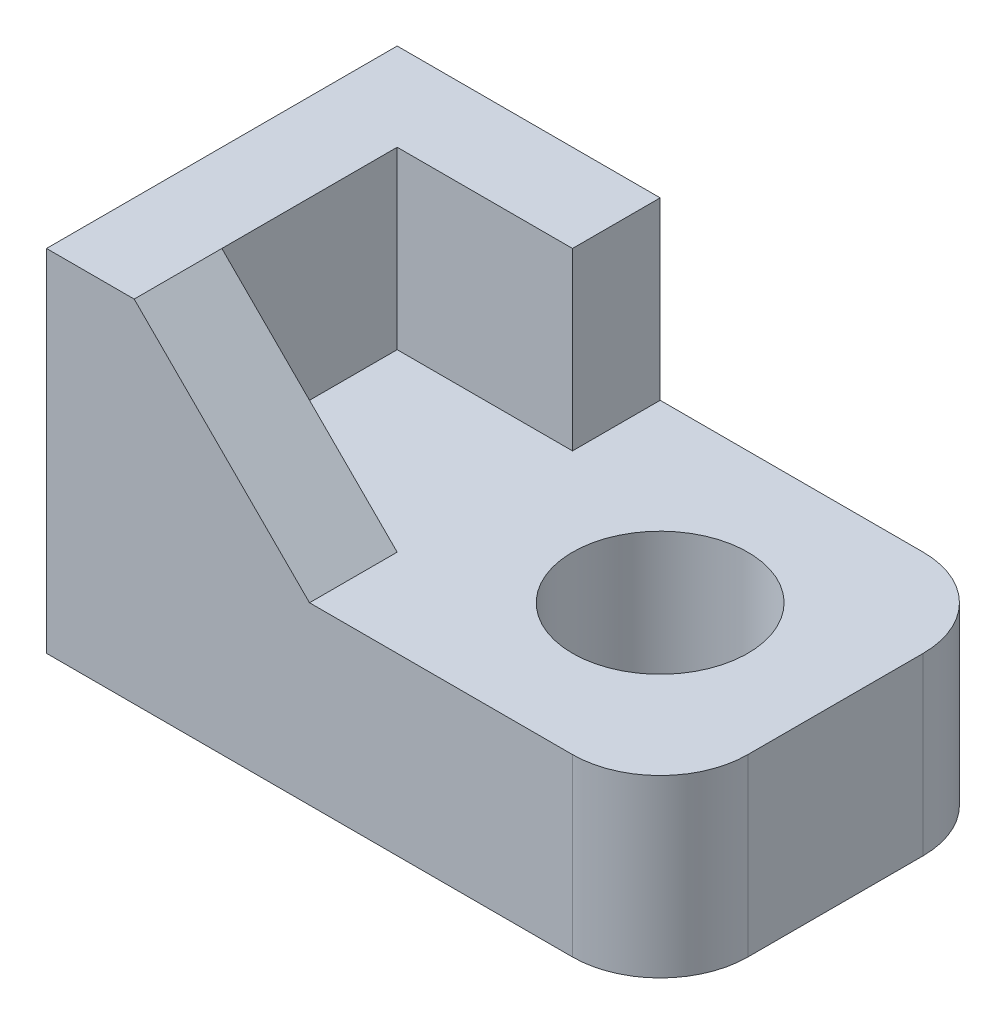
ISO-10303-21;
HEADER;
FILE_DESCRIPTION(('STEP AP214'),'2;1');
FILE_NAME('part.step','',(''),(''),'','','');
FILE_SCHEMA(('AUTOMOTIVE_DESIGN { 1 0 10303 214 1 1 1 1 }'));
ENDSEC;
DATA;
#1=APPLICATION_CONTEXT('core data for automotive mechanical design processes');
#2=APPLICATION_PROTOCOL_DEFINITION('international standard','automotive_design',2000,#1);
#3=PRODUCT_CONTEXT('',#1,'mechanical');
#4=PRODUCT('Part','Part','',(#3));
#5=PRODUCT_RELATED_PRODUCT_CATEGORY('part','',(#4));
#6=PRODUCT_DEFINITION_FORMATION('','',#4);
#7=PRODUCT_DEFINITION_CONTEXT('part definition',#1,'design');
#8=PRODUCT_DEFINITION('design','',#6,#7);
#9=PRODUCT_DEFINITION_SHAPE('','',#8);
#10=(LENGTH_UNIT() NAMED_UNIT(*) SI_UNIT(.MILLI.,.METRE.));
#11=(NAMED_UNIT(*) PLANE_ANGLE_UNIT() SI_UNIT($,.RADIAN.));
#12=(NAMED_UNIT(*) SI_UNIT($,.STERADIAN.) SOLID_ANGLE_UNIT());
#13=UNCERTAINTY_MEASURE_WITH_UNIT(LENGTH_MEASURE(1.E-05),#10,'distance_accuracy_value','');
#14=(GEOMETRIC_REPRESENTATION_CONTEXT(3) GLOBAL_UNCERTAINTY_ASSIGNED_CONTEXT((#13)) GLOBAL_UNIT_ASSIGNED_CONTEXT((#10,
#11,#12)) REPRESENTATION_CONTEXT('',''));
#15=CARTESIAN_POINT('',(0.,0.,0.));
#16=DIRECTION('',(0.,0.,1.));
#17=DIRECTION('',(1.,0.,0.));
#18=AXIS2_PLACEMENT_3D('',#15,#16,#17);
#19=CARTESIAN_POINT('',(0.,10.,0.));
#20=DIRECTION('',(0.,-1.,0.));
#21=DIRECTION('',(0.,0.,-1.));
#22=AXIS2_PLACEMENT_3D('',#19,#20,#21);
#23=PLANE('',#22);
#24=CARTESIAN_POINT('',(0.,10.,0.));
#25=DIRECTION('',(0.,1.,0.));
#26=DIRECTION('',(0.,0.,1.));
#27=AXIS2_PLACEMENT_3D('',#24,#25,#26);
#28=CIRCLE('',#27,5.);
#29=CARTESIAN_POINT('',(0.,10.,5.));
#30=VERTEX_POINT('',#29);
#31=EDGE_CURVE('E165',#30,#30,#28,.T.);
#32=ORIENTED_EDGE('',*,*,#31,.F.);
#33=EDGE_LOOP('',(#32));
#34=FACE_BOUND('',#33,.T.);
#35=DIRECTION('',(0.,0.,-1.));
#36=VECTOR('',#35,1.);
#37=CARTESIAN_POINT('',(10.,10.,-10.));
#38=LINE('',#37,#36);
#39=CARTESIAN_POINT('',(10.,10.,5.));
#40=VERTEX_POINT('',#39);
#41=CARTESIAN_POINT('',(10.,10.,-5.));
#42=VERTEX_POINT('',#41);
#43=EDGE_CURVE('E171',#40,#42,#38,.T.);
#44=ORIENTED_EDGE('',*,*,#43,.T.);
#45=CARTESIAN_POINT('',(5.,10.,-5.));
#46=DIRECTION('',(0.,-1.,0.));
#47=DIRECTION('',(0.,0.,-1.));
#48=AXIS2_PLACEMENT_3D('',#45,#46,#47);
#49=CIRCLE('',#48,5.);
#50=CARTESIAN_POINT('',(5.,10.,-10.));
#51=VERTEX_POINT('',#50);
#52=EDGE_CURVE('E43',#42,#51,#49,.F.);
#53=ORIENTED_EDGE('',*,*,#52,.T.);
#54=DIRECTION('',(-1.,0.,0.));
#55=VECTOR('',#54,1.);
#56=CARTESIAN_POINT('',(10.,10.,-10.));
#57=LINE('',#56,#55);
#58=CARTESIAN_POINT('',(-10.,10.,-10.));
#59=VERTEX_POINT('',#58);
#60=EDGE_CURVE('E173',#51,#59,#57,.T.);
#61=ORIENTED_EDGE('',*,*,#60,.T.);
#62=DIRECTION('',(0.,0.,1.));
#63=VECTOR('',#62,1.);
#64=CARTESIAN_POINT('',(-10.,10.,0.));
#65=LINE('',#64,#63);
#66=CARTESIAN_POINT('',(-10.,10.,-5.));
#67=VERTEX_POINT('',#66);
#68=EDGE_CURVE('E147',#59,#67,#65,.T.);
#69=ORIENTED_EDGE('',*,*,#68,.T.);
#70=DIRECTION('',(-1.,0.,0.));
#71=VECTOR('',#70,1.);
#72=CARTESIAN_POINT('',(0.,10.,-5.));
#73=LINE('',#72,#71);
#74=CARTESIAN_POINT('',(-20.,10.,-5.));
#75=VERTEX_POINT('',#74);
#76=EDGE_CURVE('E144',#67,#75,#73,.T.);
#77=ORIENTED_EDGE('',*,*,#76,.T.);
#78=DIRECTION('',(0.,0.,-1.));
#79=VECTOR('',#78,1.);
#80=CARTESIAN_POINT('',(-20.,10.,0.));
#81=LINE('',#80,#79);
#82=CARTESIAN_POINT('',(-20.,10.,5.));
#83=VERTEX_POINT('',#82);
#84=EDGE_CURVE('E138',#83,#75,#81,.T.);
#85=ORIENTED_EDGE('',*,*,#84,.F.);
#86=DIRECTION('',(-1.,0.,0.));
#87=VECTOR('',#86,1.);
#88=CARTESIAN_POINT('',(0.,10.,5.));
#89=LINE('',#88,#87);
#90=CARTESIAN_POINT('',(-10.,10.,5.));
#91=VERTEX_POINT('',#90);
#92=EDGE_CURVE('E123',#91,#83,#89,.T.);
#93=ORIENTED_EDGE('',*,*,#92,.F.);
#94=DIRECTION('',(0.,0.,1.));
#95=VECTOR('',#94,1.);
#96=CARTESIAN_POINT('',(-10.,10.,5.));
#97=LINE('',#96,#95);
#98=CARTESIAN_POINT('',(-10.,10.,10.));
#99=VERTEX_POINT('',#98);
#100=EDGE_CURVE('E133',#91,#99,#97,.T.);
#101=ORIENTED_EDGE('',*,*,#100,.T.);
#102=DIRECTION('',(1.,0.,0.));
#103=VECTOR('',#102,1.);
#104=CARTESIAN_POINT('',(10.,10.,10.));
#105=LINE('',#104,#103);
#106=CARTESIAN_POINT('',(5.,10.,10.));
#107=VERTEX_POINT('',#106);
#108=EDGE_CURVE('E176',#99,#107,#105,.T.);
#109=ORIENTED_EDGE('',*,*,#108,.T.);
#110=CARTESIAN_POINT('',(5.,10.,5.));
#111=DIRECTION('',(0.,-1.,0.));
#112=DIRECTION('',(0.,0.,-1.));
#113=AXIS2_PLACEMENT_3D('',#110,#111,#112);
#114=CIRCLE('',#113,5.);
#115=EDGE_CURVE('E201',#107,#40,#114,.F.);
#116=ORIENTED_EDGE('',*,*,#115,.T.);
#117=EDGE_LOOP('',(#44,#53,#61,#69,#77,#85,#93,#101,#109,#116));
#118=FACE_BOUND('',#117,.T.);
#119=ADVANCED_FACE('F35',(#34,#118),#23,.F.);
#120=CARTESIAN_POINT('',(-20.,20.,0.));
#121=DIRECTION('',(-1.,0.,0.));
#122=DIRECTION('',(0.,0.,1.));
#123=AXIS2_PLACEMENT_3D('',#120,#121,#122);
#124=PLANE('',#123);
#125=DIRECTION('',(0.,1.,0.));
#126=VECTOR('',#125,1.);
#127=CARTESIAN_POINT('',(-20.,0.,5.));
#128=LINE('',#127,#126);
#129=CARTESIAN_POINT('',(-20.,20.,5.));
#130=VERTEX_POINT('',#129);
#131=EDGE_CURVE('E126',#83,#130,#128,.T.);
#132=ORIENTED_EDGE('',*,*,#131,.F.);
#133=ORIENTED_EDGE('',*,*,#84,.T.);
#134=DIRECTION('',(0.,-1.,0.));
#135=VECTOR('',#134,1.);
#136=CARTESIAN_POINT('',(-20.,20.,-5.));
#137=LINE('',#136,#135);
#138=CARTESIAN_POINT('',(-20.,20.,-5.));
#139=VERTEX_POINT('',#138);
#140=EDGE_CURVE('E162',#139,#75,#137,.T.);
#141=ORIENTED_EDGE('',*,*,#140,.F.);
#142=DIRECTION('',(0.,0.,-1.));
#143=VECTOR('',#142,1.);
#144=CARTESIAN_POINT('',(-20.,20.,0.));
#145=LINE('',#144,#143);
#146=EDGE_CURVE('E140',#130,#139,#145,.T.);
#147=ORIENTED_EDGE('',*,*,#146,.F.);
#148=EDGE_LOOP('',(#132,#133,#141,#147));
#149=FACE_BOUND('',#148,.T.);
#150=ADVANCED_FACE('F136',(#149),#124,.F.);
#151=CARTESIAN_POINT('',(0.,0.,0.));
#152=DIRECTION('',(0.,-1.,0.));
#153=DIRECTION('',(0.,0.,-1.));
#154=AXIS2_PLACEMENT_3D('',#151,#152,#153);
#155=PLANE('',#154);
#156=DIRECTION('',(-1.,0.,0.));
#157=VECTOR('',#156,1.);
#158=CARTESIAN_POINT('',(10.,0.,-10.));
#159=LINE('',#158,#157);
#160=CARTESIAN_POINT('',(5.,0.,-10.));
#161=VERTEX_POINT('',#160);
#162=CARTESIAN_POINT('',(-25.,0.,-9.99999999999999));
#163=VERTEX_POINT('',#162);
#164=EDGE_CURVE('E180',#161,#163,#159,.T.);
#165=ORIENTED_EDGE('',*,*,#164,.F.);
#166=CARTESIAN_POINT('',(5.,0.,-5.));
#167=DIRECTION('',(0.,-1.,0.));
#168=DIRECTION('',(0.,0.,-1.));
#169=AXIS2_PLACEMENT_3D('',#166,#167,#168);
#170=CIRCLE('',#169,5.);
#171=CARTESIAN_POINT('',(10.,0.,-5.));
#172=VERTEX_POINT('',#171);
#173=EDGE_CURVE('E195',#161,#172,#170,.T.);
#174=ORIENTED_EDGE('',*,*,#173,.T.);
#175=DIRECTION('',(0.,0.,-1.));
#176=VECTOR('',#175,1.);
#177=CARTESIAN_POINT('',(10.,0.,-10.));
#178=LINE('',#177,#176);
#179=CARTESIAN_POINT('',(10.,0.,5.));
#180=VERTEX_POINT('',#179);
#181=EDGE_CURVE('E168',#180,#172,#178,.T.);
#182=ORIENTED_EDGE('',*,*,#181,.F.);
#183=CARTESIAN_POINT('',(5.,0.,5.));
#184=DIRECTION('',(0.,-1.,0.));
#185=DIRECTION('',(0.,0.,-1.));
#186=AXIS2_PLACEMENT_3D('',#183,#184,#185);
#187=CIRCLE('',#186,5.);
#188=CARTESIAN_POINT('',(5.,0.,10.));
#189=VERTEX_POINT('',#188);
#190=EDGE_CURVE('E193',#180,#189,#187,.T.);
#191=ORIENTED_EDGE('',*,*,#190,.T.);
#192=DIRECTION('',(1.,0.,0.));
#193=VECTOR('',#192,1.);
#194=CARTESIAN_POINT('',(10.,0.,10.));
#195=LINE('',#194,#193);
#196=CARTESIAN_POINT('',(-25.,0.,9.99999999999999));
#197=VERTEX_POINT('',#196);
#198=EDGE_CURVE('E174',#197,#189,#195,.T.);
#199=ORIENTED_EDGE('',*,*,#198,.F.);
#200=DIRECTION('',(0.,0.,1.));
#201=VECTOR('',#200,1.);
#202=CARTESIAN_POINT('',(-25.,0.,-9.99999999999999));
#203=LINE('',#202,#201);
#204=EDGE_CURVE('E182',#163,#197,#203,.T.);
#205=ORIENTED_EDGE('',*,*,#204,.F.);
#206=EDGE_LOOP('',(#165,#174,#182,#191,#199,#205));
#207=FACE_BOUND('',#206,.T.);
#208=CARTESIAN_POINT('',(0.,0.,0.));
#209=DIRECTION('',(0.,1.,0.));
#210=DIRECTION('',(0.,0.,1.));
#211=AXIS2_PLACEMENT_3D('',#208,#209,#210);
#212=CIRCLE('',#211,5.);
#213=CARTESIAN_POINT('',(0.,0.,5.));
#214=VERTEX_POINT('',#213);
#215=EDGE_CURVE('E164',#214,#214,#212,.T.);
#216=ORIENTED_EDGE('',*,*,#215,.T.);
#217=EDGE_LOOP('',(#216));
#218=FACE_BOUND('',#217,.T.);
#219=ADVANCED_FACE('F214',(#207,#218),#155,.T.);
#220=CARTESIAN_POINT('',(10.,10.,-10.));
#221=DIRECTION('',(-1.,0.,0.));
#222=DIRECTION('',(0.,0.,1.));
#223=AXIS2_PLACEMENT_3D('',#220,#221,#222);
#224=PLANE('',#223);
#225=ORIENTED_EDGE('',*,*,#181,.T.);
#226=DIRECTION('',(0.,-1.,0.));
#227=VECTOR('',#226,1.);
#228=CARTESIAN_POINT('',(10.,10.,-5.));
#229=LINE('',#228,#227);
#230=EDGE_CURVE('E56',#172,#42,#229,.F.);
#231=ORIENTED_EDGE('',*,*,#230,.T.);
#232=ORIENTED_EDGE('',*,*,#43,.F.);
#233=DIRECTION('',(0.,-1.,0.));
#234=VECTOR('',#233,1.);
#235=CARTESIAN_POINT('',(10.,10.,5.));
#236=LINE('',#235,#234);
#237=EDGE_CURVE('E197',#40,#180,#236,.T.);
#238=ORIENTED_EDGE('',*,*,#237,.T.);
#239=EDGE_LOOP('',(#225,#231,#232,#238));
#240=FACE_BOUND('',#239,.T.);
#241=ADVANCED_FACE('F217',(#240),#224,.F.);
#242=CARTESIAN_POINT('',(10.,10.,-10.));
#243=DIRECTION('',(0.,0.,1.));
#244=DIRECTION('',(1.,0.,0.));
#245=AXIS2_PLACEMENT_3D('',#242,#243,#244);
#246=PLANE('',#245);
#247=ORIENTED_EDGE('',*,*,#60,.F.);
#248=DIRECTION('',(0.,-1.,0.));
#249=VECTOR('',#248,1.);
#250=CARTESIAN_POINT('',(5.,10.,-10.));
#251=LINE('',#250,#249);
#252=EDGE_CURVE('E190',#51,#161,#251,.T.);
#253=ORIENTED_EDGE('',*,*,#252,.T.);
#254=ORIENTED_EDGE('',*,*,#164,.T.);
#255=DIRECTION('',(0.,-1.,0.));
#256=VECTOR('',#255,1.);
#257=CARTESIAN_POINT('',(-25.,10.,-9.99999999999999));
#258=LINE('',#257,#256);
#259=CARTESIAN_POINT('',(-25.,20.,-9.99999999999999));
#260=VERTEX_POINT('',#259);
#261=EDGE_CURVE('E187',#260,#163,#258,.T.);
#262=ORIENTED_EDGE('',*,*,#261,.F.);
#263=DIRECTION('',(-1.,0.,0.));
#264=VECTOR('',#263,1.);
#265=CARTESIAN_POINT('',(0.,20.,-10.));
#266=LINE('',#265,#264);
#267=CARTESIAN_POINT('',(-10.,20.,-10.));
#268=VERTEX_POINT('',#267);
#269=EDGE_CURVE('E151',#268,#260,#266,.T.);
#270=ORIENTED_EDGE('',*,*,#269,.F.);
#271=DIRECTION('',(0.,-1.,0.));
#272=VECTOR('',#271,1.);
#273=CARTESIAN_POINT('',(-10.,20.,-10.));
#274=LINE('',#273,#272);
#275=EDGE_CURVE('E156',#268,#59,#274,.T.);
#276=ORIENTED_EDGE('',*,*,#275,.T.);
#277=EDGE_LOOP('',(#247,#253,#254,#262,#270,#276));
#278=FACE_BOUND('',#277,.T.);
#279=ADVANCED_FACE('F207',(#278),#246,.F.);
#280=CARTESIAN_POINT('',(-25.,10.,-9.99999999999999));
#281=DIRECTION('',(1.,0.,0.));
#282=DIRECTION('',(0.,0.,-1.));
#283=AXIS2_PLACEMENT_3D('',#280,#281,#282);
#284=PLANE('',#283);
#285=ORIENTED_EDGE('',*,*,#204,.T.);
#286=DIRECTION('',(0.,-1.,0.));
#287=VECTOR('',#286,1.);
#288=CARTESIAN_POINT('',(-25.,10.,9.99999999999999));
#289=LINE('',#288,#287);
#290=CARTESIAN_POINT('',(-25.,20.,9.99999999999999));
#291=VERTEX_POINT('',#290);
#292=EDGE_CURVE('E178',#291,#197,#289,.T.);
#293=ORIENTED_EDGE('',*,*,#292,.F.);
#294=DIRECTION('',(0.,0.,1.));
#295=VECTOR('',#294,1.);
#296=CARTESIAN_POINT('',(-25.,20.,0.));
#297=LINE('',#296,#295);
#298=EDGE_CURVE('E155',#260,#291,#297,.T.);
#299=ORIENTED_EDGE('',*,*,#298,.F.);
#300=ORIENTED_EDGE('',*,*,#261,.T.);
#301=EDGE_LOOP('',(#285,#293,#299,#300));
#302=FACE_BOUND('',#301,.T.);
#303=ADVANCED_FACE('F230',(#302),#284,.F.);
#304=CARTESIAN_POINT('',(10.,10.,10.));
#305=DIRECTION('',(0.,0.,-1.));
#306=DIRECTION('',(-1.,0.,0.));
#307=AXIS2_PLACEMENT_3D('',#304,#305,#306);
#308=PLANE('',#307);
#309=ORIENTED_EDGE('',*,*,#198,.T.);
#310=DIRECTION('',(0.,-1.,0.));
#311=VECTOR('',#310,1.);
#312=CARTESIAN_POINT('',(5.,10.,10.));
#313=LINE('',#312,#311);
#314=EDGE_CURVE('E11',#189,#107,#313,.F.);
#315=ORIENTED_EDGE('',*,*,#314,.T.);
#316=ORIENTED_EDGE('',*,*,#108,.F.);
#317=DIRECTION('',(0.707106781186547,-0.707106781186548,0.));
#318=VECTOR('',#317,1.);
#319=CARTESIAN_POINT('',(0.,0.,10.));
#320=LINE('',#319,#318);
#321=CARTESIAN_POINT('',(-20.,20.,10.));
#322=VERTEX_POINT('',#321);
#323=EDGE_CURVE('E247',#322,#99,#320,.T.);
#324=ORIENTED_EDGE('',*,*,#323,.F.);
#325=DIRECTION('',(1.,0.,0.));
#326=VECTOR('',#325,1.);
#327=CARTESIAN_POINT('',(0.,20.,10.));
#328=LINE('',#327,#326);
#329=EDGE_CURVE('E226',#291,#322,#328,.T.);
#330=ORIENTED_EDGE('',*,*,#329,.F.);
#331=ORIENTED_EDGE('',*,*,#292,.T.);
#332=EDGE_LOOP('',(#309,#315,#316,#324,#330,#331));
#333=FACE_BOUND('',#332,.T.);
#334=ADVANCED_FACE('F222',(#333),#308,.F.);
#335=CARTESIAN_POINT('',(0.,10.,0.));
#336=DIRECTION('',(0.,-1.,0.));
#337=DIRECTION('',(0.,0.,-1.));
#338=AXIS2_PLACEMENT_3D('',#335,#336,#337);
#339=CYLINDRICAL_SURFACE('',#338,5.);
#340=ORIENTED_EDGE('',*,*,#31,.T.);
#341=EDGE_LOOP('',(#340));
#342=FACE_BOUND('',#341,.T.);
#343=ORIENTED_EDGE('',*,*,#215,.F.);
#344=EDGE_LOOP('',(#343));
#345=FACE_BOUND('',#344,.T.);
#346=ADVANCED_FACE('F261',(#342,#345),#339,.F.);
#347=CARTESIAN_POINT('',(0.,20.,-5.));
#348=DIRECTION('',(0.,0.,1.));
#349=DIRECTION('',(1.,0.,0.));
#350=AXIS2_PLACEMENT_3D('',#347,#348,#349);
#351=PLANE('',#350);
#352=ORIENTED_EDGE('',*,*,#76,.F.);
#353=DIRECTION('',(0.,-1.,0.));
#354=VECTOR('',#353,1.);
#355=CARTESIAN_POINT('',(-10.,20.,-5.));
#356=LINE('',#355,#354);
#357=CARTESIAN_POINT('',(-10.,20.,-5.));
#358=VERTEX_POINT('',#357);
#359=EDGE_CURVE('E159',#358,#67,#356,.T.);
#360=ORIENTED_EDGE('',*,*,#359,.F.);
#361=DIRECTION('',(-1.,0.,0.));
#362=VECTOR('',#361,1.);
#363=CARTESIAN_POINT('',(0.,20.,-5.));
#364=LINE('',#363,#362);
#365=EDGE_CURVE('E238',#358,#139,#364,.T.);
#366=ORIENTED_EDGE('',*,*,#365,.T.);
#367=ORIENTED_EDGE('',*,*,#140,.T.);
#368=EDGE_LOOP('',(#352,#360,#366,#367));
#369=FACE_BOUND('',#368,.T.);
#370=ADVANCED_FACE('F252',(#369),#351,.T.);
#371=CARTESIAN_POINT('',(-10.,20.,0.));
#372=DIRECTION('',(1.,0.,0.));
#373=DIRECTION('',(0.,0.,-1.));
#374=AXIS2_PLACEMENT_3D('',#371,#372,#373);
#375=PLANE('',#374);
#376=ORIENTED_EDGE('',*,*,#68,.F.);
#377=ORIENTED_EDGE('',*,*,#275,.F.);
#378=DIRECTION('',(0.,0.,1.));
#379=VECTOR('',#378,1.);
#380=CARTESIAN_POINT('',(-10.,20.,0.));
#381=LINE('',#380,#379);
#382=EDGE_CURVE('E237',#268,#358,#381,.T.);
#383=ORIENTED_EDGE('',*,*,#382,.T.);
#384=ORIENTED_EDGE('',*,*,#359,.T.);
#385=EDGE_LOOP('',(#376,#377,#383,#384));
#386=FACE_BOUND('',#385,.T.);
#387=ADVANCED_FACE('F253',(#386),#375,.T.);
#388=CARTESIAN_POINT('',(0.,20.,0.));
#389=DIRECTION('',(0.,1.,0.));
#390=DIRECTION('',(0.,0.,1.));
#391=AXIS2_PLACEMENT_3D('',#388,#389,#390);
#392=PLANE('',#391);
#393=ORIENTED_EDGE('',*,*,#298,.T.);
#394=ORIENTED_EDGE('',*,*,#329,.T.);
#395=EDGE_CURVE('E241',#322,#130,#145,.T.);
#396=ORIENTED_EDGE('',*,*,#395,.T.);
#397=ORIENTED_EDGE('',*,*,#146,.T.);
#398=ORIENTED_EDGE('',*,*,#365,.F.);
#399=ORIENTED_EDGE('',*,*,#382,.F.);
#400=ORIENTED_EDGE('',*,*,#269,.T.);
#401=EDGE_LOOP('',(#393,#394,#396,#397,#398,#399,#400));
#402=FACE_BOUND('',#401,.T.);
#403=ADVANCED_FACE('F234',(#402),#392,.T.);
#404=CARTESIAN_POINT('',(0.,0.,5.));
#405=DIRECTION('',(-0.707106781186548,-0.707106781186547,0.));
#406=DIRECTION('',(0.707106781186547,-0.707106781186548,0.));
#407=AXIS2_PLACEMENT_3D('',#404,#405,#406);
#408=PLANE('',#407);
#409=ORIENTED_EDGE('',*,*,#323,.T.);
#410=ORIENTED_EDGE('',*,*,#100,.F.);
#411=DIRECTION('',(0.707106781186547,-0.707106781186548,0.));
#412=VECTOR('',#411,1.);
#413=CARTESIAN_POINT('',(0.,0.,5.));
#414=LINE('',#413,#412);
#415=EDGE_CURVE('E128',#130,#91,#414,.T.);
#416=ORIENTED_EDGE('',*,*,#415,.F.);
#417=ORIENTED_EDGE('',*,*,#395,.F.);
#418=EDGE_LOOP('',(#409,#410,#416,#417));
#419=FACE_BOUND('',#418,.T.);
#420=ADVANCED_FACE('F250',(#419),#408,.F.);
#421=CARTESIAN_POINT('',(0.,0.,5.));
#422=DIRECTION('',(0.,0.,1.));
#423=DIRECTION('',(1.,0.,0.));
#424=AXIS2_PLACEMENT_3D('',#421,#422,#423);
#425=PLANE('',#424);
#426=ORIENTED_EDGE('',*,*,#415,.T.);
#427=ORIENTED_EDGE('',*,*,#92,.T.);
#428=ORIENTED_EDGE('',*,*,#131,.T.);
#429=EDGE_LOOP('',(#426,#427,#428));
#430=FACE_BOUND('',#429,.T.);
#431=ADVANCED_FACE('F125',(#430),#425,.F.);
#432=CARTESIAN_POINT('',(5.,10.,-5.));
#433=DIRECTION('',(0.,-1.,0.));
#434=DIRECTION('',(0.,0.,-1.));
#435=AXIS2_PLACEMENT_3D('',#432,#433,#434);
#436=CYLINDRICAL_SURFACE('',#435,5.);
#437=ORIENTED_EDGE('',*,*,#52,.F.);
#438=ORIENTED_EDGE('',*,*,#230,.F.);
#439=ORIENTED_EDGE('',*,*,#173,.F.);
#440=ORIENTED_EDGE('',*,*,#252,.F.);
#441=EDGE_LOOP('',(#437,#438,#439,#440));
#442=FACE_BOUND('',#441,.T.);
#443=ADVANCED_FACE('F211',(#442),#436,.T.);
#444=CARTESIAN_POINT('',(5.,10.,5.));
#445=DIRECTION('',(0.,-1.,0.));
#446=DIRECTION('',(0.,0.,-1.));
#447=AXIS2_PLACEMENT_3D('',#444,#445,#446);
#448=CYLINDRICAL_SURFACE('',#447,5.);
#449=ORIENTED_EDGE('',*,*,#115,.F.);
#450=ORIENTED_EDGE('',*,*,#314,.F.);
#451=ORIENTED_EDGE('',*,*,#190,.F.);
#452=ORIENTED_EDGE('',*,*,#237,.F.);
#453=EDGE_LOOP('',(#449,#450,#451,#452));
#454=FACE_BOUND('',#453,.T.);
#455=ADVANCED_FACE('F37',(#454),#448,.T.);
#456=CLOSED_SHELL('',(#119,#150,#219,#241,#279,#303,#334,#346,#370,#387,#403,#420,#431,#443,#455));
#457=MANIFOLD_SOLID_BREP('B2',#456);
#458=ADVANCED_BREP_SHAPE_REPRESENTATION('',(#18,#457),#14);
#459=SHAPE_DEFINITION_REPRESENTATION(#9,#458);
ENDSEC;
END-ISO-10303-21;
